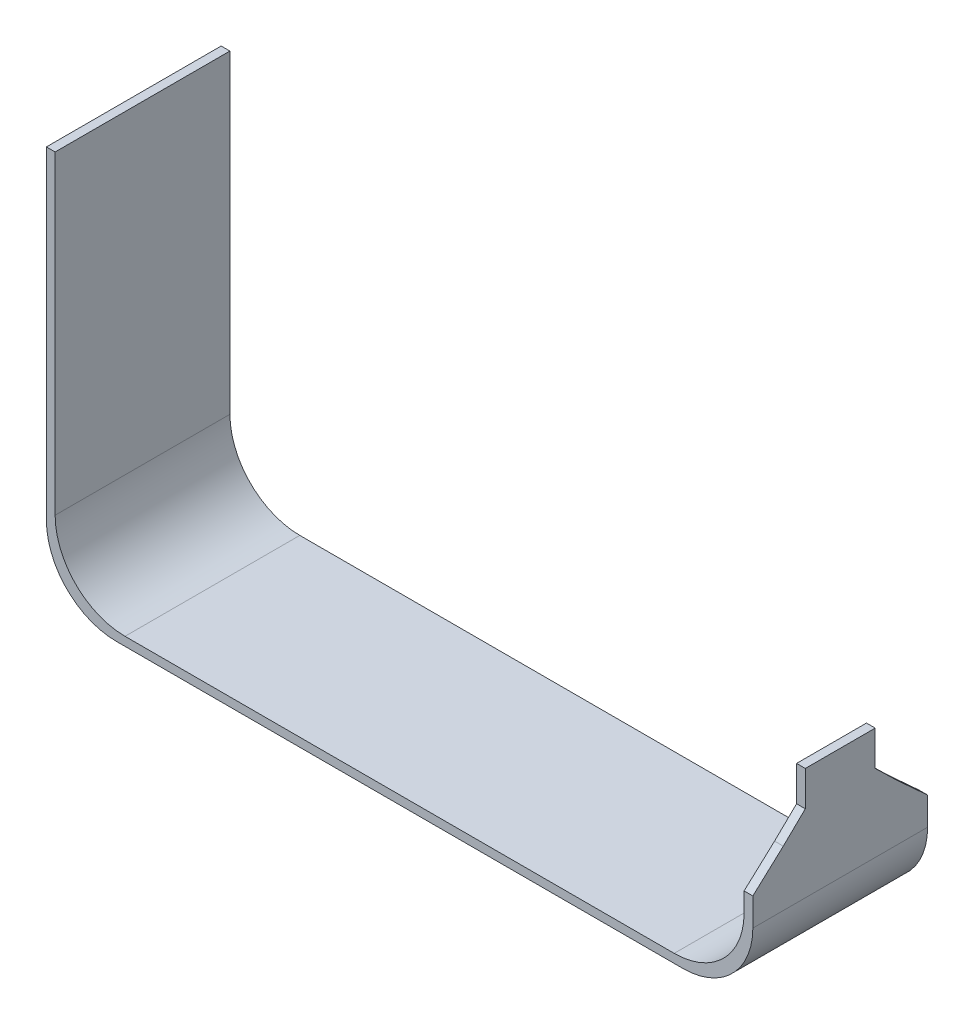
ISO-10303-21;
HEADER;
FILE_DESCRIPTION(('STEP AP214'),'2;1');
FILE_NAME('part.step','',(''),(''),'','','');
FILE_SCHEMA(('AUTOMOTIVE_DESIGN { 1 0 10303 214 1 1 1 1 }'));
ENDSEC;
DATA;
#1=APPLICATION_CONTEXT('core data for automotive mechanical design processes');
#2=APPLICATION_PROTOCOL_DEFINITION('international standard','automotive_design',2000,#1);
#3=PRODUCT_CONTEXT('',#1,'mechanical');
#4=PRODUCT('Part','Part','',(#3));
#5=PRODUCT_RELATED_PRODUCT_CATEGORY('part','',(#4));
#6=PRODUCT_DEFINITION_FORMATION('','',#4);
#7=PRODUCT_DEFINITION_CONTEXT('part definition',#1,'design');
#8=PRODUCT_DEFINITION('design','',#6,#7);
#9=PRODUCT_DEFINITION_SHAPE('','',#8);
#10=(LENGTH_UNIT() NAMED_UNIT(*) SI_UNIT(.MILLI.,.METRE.));
#11=(NAMED_UNIT(*) PLANE_ANGLE_UNIT() SI_UNIT($,.RADIAN.));
#12=(NAMED_UNIT(*) SI_UNIT($,.STERADIAN.) SOLID_ANGLE_UNIT());
#13=UNCERTAINTY_MEASURE_WITH_UNIT(LENGTH_MEASURE(1.E-05),#10,'distance_accuracy_value','');
#14=(GEOMETRIC_REPRESENTATION_CONTEXT(3) GLOBAL_UNCERTAINTY_ASSIGNED_CONTEXT((#13)) GLOBAL_UNIT_ASSIGNED_CONTEXT((#10,
#11,#12)) REPRESENTATION_CONTEXT('',''));
#15=CARTESIAN_POINT('',(0.,0.,0.));
#16=DIRECTION('',(0.,0.,1.));
#17=DIRECTION('',(1.,0.,0.));
#18=AXIS2_PLACEMENT_3D('',#15,#16,#17);
#19=CARTESIAN_POINT('',(-14.7872093023256,2.25,0.));
#20=DIRECTION('',(0.,0.,-1.));
#21=DIRECTION('',(-1.,0.,0.));
#22=AXIS2_PLACEMENT_3D('',#19,#20,#21);
#23=CYLINDRICAL_SURFACE('',#22,2.);
#24=CARTESIAN_POINT('',(-14.7872093023256,2.25,-5.93488372093023));
#25=DIRECTION('',(0.,0.,1.));
#26=DIRECTION('',(1.,0.,0.));
#27=AXIS2_PLACEMENT_3D('',#24,#25,#26);
#28=CIRCLE('',#27,2.);
#29=CARTESIAN_POINT('',(-16.7872093023256,2.25,-5.93488372093023));
#30=VERTEX_POINT('',#29);
#31=CARTESIAN_POINT('',(-14.7872093023256,0.25,-5.93488372093023));
#32=VERTEX_POINT('',#31);
#33=EDGE_CURVE('E261',#30,#32,#28,.T.);
#34=ORIENTED_EDGE('',*,*,#33,.F.);
#35=DIRECTION('',(0.,0.,1.));
#36=VECTOR('',#35,1.);
#37=CARTESIAN_POINT('',(-16.7872093023256,2.25,-5.93488372093023));
#38=LINE('',#37,#36);
#39=CARTESIAN_POINT('',(-16.7872093023256,2.25,-0.934883720930232));
#40=VERTEX_POINT('',#39);
#41=EDGE_CURVE('E257',#40,#30,#38,.F.);
#42=ORIENTED_EDGE('',*,*,#41,.F.);
#43=CARTESIAN_POINT('',(-14.7872093023256,2.25,-0.934883720930232));
#44=DIRECTION('',(0.,0.,-1.));
#45=DIRECTION('',(-1.,0.,0.));
#46=AXIS2_PLACEMENT_3D('',#43,#44,#45);
#47=CIRCLE('',#46,2.);
#48=CARTESIAN_POINT('',(-14.7872093023256,0.25,-0.934883720930232));
#49=VERTEX_POINT('',#48);
#50=EDGE_CURVE('E259',#49,#40,#47,.T.);
#51=ORIENTED_EDGE('',*,*,#50,.F.);
#52=DIRECTION('',(0.,0.,1.));
#53=VECTOR('',#52,1.);
#54=CARTESIAN_POINT('',(-14.7872093023256,0.25,-0.934883720930232));
#55=LINE('',#54,#53);
#56=EDGE_CURVE('E254',#32,#49,#55,.T.);
#57=ORIENTED_EDGE('',*,*,#56,.F.);
#58=EDGE_LOOP('',(#34,#42,#51,#57));
#59=FACE_BOUND('',#58,.T.);
#60=ADVANCED_FACE('F37',(#59),#23,.F.);
#61=CARTESIAN_POINT('',(-16.7872093023256,0.,0.));
#62=DIRECTION('',(1.,0.,0.));
#63=DIRECTION('',(0.,0.,-1.));
#64=AXIS2_PLACEMENT_3D('',#61,#62,#63);
#65=PLANE('',#64);
#66=DIRECTION('',(0.,1.,0.));
#67=VECTOR('',#66,1.);
#68=CARTESIAN_POINT('',(-16.7872093023256,0.25,-0.934883720930232));
#69=LINE('',#68,#67);
#70=CARTESIAN_POINT('',(-16.7872093023256,11.25,-0.934883720930232));
#71=VERTEX_POINT('',#70);
#72=EDGE_CURVE('E226',#40,#71,#69,.T.);
#73=ORIENTED_EDGE('',*,*,#72,.F.);
#74=ORIENTED_EDGE('',*,*,#41,.T.);
#75=DIRECTION('',(0.,-1.,0.));
#76=VECTOR('',#75,1.);
#77=CARTESIAN_POINT('',(-16.7872093023256,0.25,-5.93488372093023));
#78=LINE('',#77,#76);
#79=CARTESIAN_POINT('',(-16.7872093023256,11.25,-5.93488372093023));
#80=VERTEX_POINT('',#79);
#81=EDGE_CURVE('E223',#80,#30,#78,.T.);
#82=ORIENTED_EDGE('',*,*,#81,.F.);
#83=DIRECTION('',(0.,0.,-1.));
#84=VECTOR('',#83,1.);
#85=CARTESIAN_POINT('',(-16.7872093023256,11.25,-5.93488372093023));
#86=LINE('',#85,#84);
#87=EDGE_CURVE('E228',#71,#80,#86,.T.);
#88=ORIENTED_EDGE('',*,*,#87,.F.);
#89=EDGE_LOOP('',(#73,#74,#82,#88));
#90=FACE_BOUND('',#89,.T.);
#91=ADVANCED_FACE('F313',(#90),#65,.T.);
#92=CARTESIAN_POINT('',(-16.7872093023256,11.25,-5.93488372093023));
#93=DIRECTION('',(0.,1.,0.));
#94=DIRECTION('',(0.,0.,1.));
#95=AXIS2_PLACEMENT_3D('',#92,#93,#94);
#96=PLANE('',#95);
#97=DIRECTION('',(0.,0.,-1.));
#98=VECTOR('',#97,1.);
#99=CARTESIAN_POINT('',(-17.0372093023256,11.25,-5.93488372093023));
#100=LINE('',#99,#98);
#101=CARTESIAN_POINT('',(-17.0372093023256,11.25,-0.934883720930232));
#102=VERTEX_POINT('',#101);
#103=CARTESIAN_POINT('',(-17.0372093023256,11.25,-5.93488372093023));
#104=VERTEX_POINT('',#103);
#105=EDGE_CURVE('E219',#102,#104,#100,.T.);
#106=ORIENTED_EDGE('',*,*,#105,.F.);
#107=DIRECTION('',(-1.,0.,0.));
#108=VECTOR('',#107,1.);
#109=CARTESIAN_POINT('',(-16.7872093023256,11.25,-0.934883720930232));
#110=LINE('',#109,#108);
#111=EDGE_CURVE('E231',#71,#102,#110,.T.);
#112=ORIENTED_EDGE('',*,*,#111,.F.);
#113=ORIENTED_EDGE('',*,*,#87,.T.);
#114=DIRECTION('',(-1.,0.,0.));
#115=VECTOR('',#114,1.);
#116=CARTESIAN_POINT('',(-16.7872093023256,11.25,-5.93488372093023));
#117=LINE('',#116,#115);
#118=EDGE_CURVE('E234',#80,#104,#117,.T.);
#119=ORIENTED_EDGE('',*,*,#118,.T.);
#120=EDGE_LOOP('',(#106,#112,#113,#119));
#121=FACE_BOUND('',#120,.T.);
#122=ADVANCED_FACE('F307',(#121),#96,.T.);
#123=CARTESIAN_POINT('',(-17.0372093023256,0.25,-5.93488372093023));
#124=DIRECTION('',(1.,0.,0.));
#125=DIRECTION('',(0.,0.,-1.));
#126=AXIS2_PLACEMENT_3D('',#123,#124,#125);
#127=PLANE('',#126);
#128=DIRECTION('',(0.,-1.,0.));
#129=VECTOR('',#128,1.);
#130=CARTESIAN_POINT('',(-17.0372093023256,0.25,-5.93488372093023));
#131=LINE('',#130,#129);
#132=CARTESIAN_POINT('',(-17.0372093023256,2.,-5.93488372093023));
#133=VERTEX_POINT('',#132);
#134=EDGE_CURVE('E246',#104,#133,#131,.T.);
#135=ORIENTED_EDGE('',*,*,#134,.T.);
#136=DIRECTION('',(0.,0.,1.));
#137=VECTOR('',#136,1.);
#138=CARTESIAN_POINT('',(-17.0372093023256,2.,-5.93488372093023));
#139=LINE('',#138,#137);
#140=CARTESIAN_POINT('',(-17.0372093023256,2.,-0.934883720930232));
#141=VERTEX_POINT('',#140);
#142=EDGE_CURVE('E271',#133,#141,#139,.T.);
#143=ORIENTED_EDGE('',*,*,#142,.T.);
#144=DIRECTION('',(0.,-1.,0.));
#145=VECTOR('',#144,1.);
#146=CARTESIAN_POINT('',(-17.0372093023256,0.25,-0.934883720930232));
#147=LINE('',#146,#145);
#148=EDGE_CURVE('E251',#102,#141,#147,.T.);
#149=ORIENTED_EDGE('',*,*,#148,.F.);
#150=ORIENTED_EDGE('',*,*,#105,.T.);
#151=EDGE_LOOP('',(#135,#143,#149,#150));
#152=FACE_BOUND('',#151,.T.);
#153=ADVANCED_FACE('F303',(#152),#127,.F.);
#154=CARTESIAN_POINT('',(-15.0372093023256,2.,-5.93488372093023));
#155=DIRECTION('',(0.,0.,1.));
#156=DIRECTION('',(1.,0.,0.));
#157=AXIS2_PLACEMENT_3D('',#154,#155,#156);
#158=CYLINDRICAL_SURFACE('',#157,2.);
#159=CARTESIAN_POINT('',(-15.0372093023256,2.,-5.93488372093023));
#160=DIRECTION('',(0.,0.,1.));
#161=DIRECTION('',(1.,0.,0.));
#162=AXIS2_PLACEMENT_3D('',#159,#160,#161);
#163=CIRCLE('',#162,2.);
#164=CARTESIAN_POINT('',(-15.0372093023256,0.,-5.93488372093023));
#165=VERTEX_POINT('',#164);
#166=EDGE_CURVE('E264',#165,#133,#163,.F.);
#167=ORIENTED_EDGE('',*,*,#166,.F.);
#168=DIRECTION('',(0.,0.,1.));
#169=VECTOR('',#168,1.);
#170=CARTESIAN_POINT('',(-15.0372093023256,0.,0.));
#171=LINE('',#170,#169);
#172=CARTESIAN_POINT('',(-15.0372093023256,0.,-0.934883720930232));
#173=VERTEX_POINT('',#172);
#174=EDGE_CURVE('E266',#173,#165,#171,.F.);
#175=ORIENTED_EDGE('',*,*,#174,.F.);
#176=CARTESIAN_POINT('',(-15.0372093023256,2.,-0.934883720930232));
#177=DIRECTION('',(0.,0.,-1.));
#178=DIRECTION('',(-1.,0.,0.));
#179=AXIS2_PLACEMENT_3D('',#176,#177,#178);
#180=CIRCLE('',#179,2.);
#181=EDGE_CURVE('E269',#141,#173,#180,.F.);
#182=ORIENTED_EDGE('',*,*,#181,.F.);
#183=ORIENTED_EDGE('',*,*,#142,.F.);
#184=EDGE_LOOP('',(#167,#175,#182,#183));
#185=FACE_BOUND('',#184,.T.);
#186=ADVANCED_FACE('F300',(#185),#158,.T.);
#187=CARTESIAN_POINT('',(0.,0.,0.));
#188=DIRECTION('',(0.,1.,0.));
#189=DIRECTION('',(0.,0.,1.));
#190=AXIS2_PLACEMENT_3D('',#187,#188,#189);
#191=PLANE('',#190);
#192=DIRECTION('',(-1.,0.,0.));
#193=VECTOR('',#192,1.);
#194=CARTESIAN_POINT('',(-17.0372093023256,0.,-5.93488372093023));
#195=LINE('',#194,#193);
#196=CARTESIAN_POINT('',(1.17333889146334,0.,-5.93488372093023));
#197=VERTEX_POINT('',#196);
#198=EDGE_CURVE('E244',#197,#165,#195,.T.);
#199=ORIENTED_EDGE('',*,*,#198,.F.);
#200=DIRECTION('',(0.,0.,-1.));
#201=VECTOR('',#200,1.);
#202=CARTESIAN_POINT('',(1.17333889146334,0.,0.));
#203=LINE('',#202,#201);
#204=CARTESIAN_POINT('',(1.17333889146334,0.,-0.934883720930232));
#205=VERTEX_POINT('',#204);
#206=EDGE_CURVE('E45',#197,#205,#203,.F.);
#207=ORIENTED_EDGE('',*,*,#206,.T.);
#208=DIRECTION('',(1.,0.,0.));
#209=VECTOR('',#208,1.);
#210=CARTESIAN_POINT('',(-17.0372093023256,0.,-0.934883720930232));
#211=LINE('',#210,#209);
#212=EDGE_CURVE('E237',#173,#205,#211,.T.);
#213=ORIENTED_EDGE('',*,*,#212,.F.);
#214=ORIENTED_EDGE('',*,*,#174,.T.);
#215=EDGE_LOOP('',(#199,#207,#213,#214));
#216=FACE_BOUND('',#215,.T.);
#217=ADVANCED_FACE('F292',(#216),#191,.F.);
#218=CARTESIAN_POINT('',(-17.0372093023256,0.25,-5.93488372093023));
#219=DIRECTION('',(0.,0.,1.));
#220=DIRECTION('',(1.,0.,0.));
#221=AXIS2_PLACEMENT_3D('',#218,#219,#220);
#222=PLANE('',#221);
#223=DIRECTION('',(0.,1.,0.));
#224=VECTOR('',#223,1.);
#225=CARTESIAN_POINT('',(2.92333889146334,0.,-5.93488372093023));
#226=LINE('',#225,#224);
#227=CARTESIAN_POINT('',(2.92333889146334,2.25,-5.93488372093023));
#228=VERTEX_POINT('',#227);
#229=CARTESIAN_POINT('',(2.92333889146334,2.79767860252511,-5.93488372093023));
#230=VERTEX_POINT('',#229);
#231=EDGE_CURVE('E216',#228,#230,#226,.T.);
#232=ORIENTED_EDGE('',*,*,#231,.T.);
#233=DIRECTION('',(1.,0.,0.));
#234=VECTOR('',#233,1.);
#235=CARTESIAN_POINT('',(2.92333889146334,2.79767860252511,-5.93488372093023));
#236=LINE('',#235,#234);
#237=CARTESIAN_POINT('',(3.17333889146334,2.79767860252511,-5.93488372093023));
#238=VERTEX_POINT('',#237);
#239=EDGE_CURVE('E329',#230,#238,#236,.T.);
#240=ORIENTED_EDGE('',*,*,#239,.T.);
#241=DIRECTION('',(0.,1.,0.));
#242=VECTOR('',#241,1.);
#243=CARTESIAN_POINT('',(3.17333889146334,0.,-5.93488372093023));
#244=LINE('',#243,#242);
#245=CARTESIAN_POINT('',(3.17333889146334,2.,-5.93488372093023));
#246=VERTEX_POINT('',#245);
#247=EDGE_CURVE('E215',#246,#238,#244,.T.);
#248=ORIENTED_EDGE('',*,*,#247,.F.);
#249=CARTESIAN_POINT('',(1.17333889146334,2.,-5.93488372093023));
#250=DIRECTION('',(0.,0.,1.));
#251=DIRECTION('',(1.,0.,0.));
#252=AXIS2_PLACEMENT_3D('',#249,#250,#251);
#253=CIRCLE('',#252,2.);
#254=EDGE_CURVE('E285',#246,#197,#253,.F.);
#255=ORIENTED_EDGE('',*,*,#254,.T.);
#256=ORIENTED_EDGE('',*,*,#198,.T.);
#257=ORIENTED_EDGE('',*,*,#166,.T.);
#258=ORIENTED_EDGE('',*,*,#134,.F.);
#259=ORIENTED_EDGE('',*,*,#118,.F.);
#260=ORIENTED_EDGE('',*,*,#81,.T.);
#261=ORIENTED_EDGE('',*,*,#33,.T.);
#262=DIRECTION('',(-1.,0.,0.));
#263=VECTOR('',#262,1.);
#264=CARTESIAN_POINT('',(-17.0372093023256,0.25,-5.93488372093023));
#265=LINE('',#264,#263);
#266=CARTESIAN_POINT('',(0.923338891463343,0.25,-5.93488372093023));
#267=VERTEX_POINT('',#266);
#268=EDGE_CURVE('E243',#267,#32,#265,.T.);
#269=ORIENTED_EDGE('',*,*,#268,.F.);
#270=CARTESIAN_POINT('',(0.923338891463343,2.25,-5.93488372093023));
#271=DIRECTION('',(0.,0.,1.));
#272=DIRECTION('',(1.,0.,0.));
#273=AXIS2_PLACEMENT_3D('',#270,#271,#272);
#274=CIRCLE('',#273,2.);
#275=EDGE_CURVE('E280',#267,#228,#274,.T.);
#276=ORIENTED_EDGE('',*,*,#275,.T.);
#277=EDGE_LOOP('',(#232,#240,#248,#255,#256,#257,#258,#259,#260,#261,#269,#276));
#278=FACE_BOUND('',#277,.T.);
#279=ADVANCED_FACE('F288',(#278),#222,.F.);
#280=CARTESIAN_POINT('',(-17.0372093023256,0.25,-0.934883720930232));
#281=DIRECTION('',(0.,0.,-1.));
#282=DIRECTION('',(-1.,0.,0.));
#283=AXIS2_PLACEMENT_3D('',#280,#281,#282);
#284=PLANE('',#283);
#285=DIRECTION('',(0.,-1.,0.));
#286=VECTOR('',#285,1.);
#287=CARTESIAN_POINT('',(3.17333889146334,0.,-0.934883720930232));
#288=LINE('',#287,#286);
#289=CARTESIAN_POINT('',(3.17333889146334,2.79767860252511,-0.934883720930232));
#290=VERTEX_POINT('',#289);
#291=CARTESIAN_POINT('',(3.17333889146334,2.,-0.934883720930232));
#292=VERTEX_POINT('',#291);
#293=EDGE_CURVE('E213',#290,#292,#288,.T.);
#294=ORIENTED_EDGE('',*,*,#293,.F.);
#295=DIRECTION('',(1.,0.,0.));
#296=VECTOR('',#295,1.);
#297=CARTESIAN_POINT('',(2.92333889146334,2.79767860252511,-0.934883720930232));
#298=LINE('',#297,#296);
#299=CARTESIAN_POINT('',(2.92333889146334,2.79767860252511,-0.934883720930232));
#300=VERTEX_POINT('',#299);
#301=EDGE_CURVE('E179',#300,#290,#298,.T.);
#302=ORIENTED_EDGE('',*,*,#301,.F.);
#303=DIRECTION('',(0.,-1.,0.));
#304=VECTOR('',#303,1.);
#305=CARTESIAN_POINT('',(2.92333889146334,0.,-0.934883720930232));
#306=LINE('',#305,#304);
#307=CARTESIAN_POINT('',(2.92333889146334,2.25,-0.934883720930232));
#308=VERTEX_POINT('',#307);
#309=EDGE_CURVE('E169',#300,#308,#306,.T.);
#310=ORIENTED_EDGE('',*,*,#309,.T.);
#311=CARTESIAN_POINT('',(0.923338891463343,2.25,-0.934883720930232));
#312=DIRECTION('',(0.,0.,-1.));
#313=DIRECTION('',(-1.,0.,0.));
#314=AXIS2_PLACEMENT_3D('',#311,#312,#313);
#315=CIRCLE('',#314,2.);
#316=CARTESIAN_POINT('',(0.923338891463343,0.25,-0.934883720930232));
#317=VERTEX_POINT('',#316);
#318=EDGE_CURVE('E278',#308,#317,#315,.T.);
#319=ORIENTED_EDGE('',*,*,#318,.T.);
#320=DIRECTION('',(1.,0.,0.));
#321=VECTOR('',#320,1.);
#322=CARTESIAN_POINT('',(-17.0372093023256,0.25,-0.934883720930232));
#323=LINE('',#322,#321);
#324=EDGE_CURVE('E240',#49,#317,#323,.T.);
#325=ORIENTED_EDGE('',*,*,#324,.F.);
#326=ORIENTED_EDGE('',*,*,#50,.T.);
#327=ORIENTED_EDGE('',*,*,#72,.T.);
#328=ORIENTED_EDGE('',*,*,#111,.T.);
#329=ORIENTED_EDGE('',*,*,#148,.T.);
#330=ORIENTED_EDGE('',*,*,#181,.T.);
#331=ORIENTED_EDGE('',*,*,#212,.T.);
#332=CARTESIAN_POINT('',(1.17333889146334,2.,-0.934883720930232));
#333=DIRECTION('',(0.,0.,-1.));
#334=DIRECTION('',(-1.,0.,0.));
#335=AXIS2_PLACEMENT_3D('',#332,#333,#334);
#336=CIRCLE('',#335,2.);
#337=EDGE_CURVE('E11',#205,#292,#336,.F.);
#338=ORIENTED_EDGE('',*,*,#337,.T.);
#339=EDGE_LOOP('',(#294,#302,#310,#319,#325,#326,#327,#328,#329,#330,#331,#338));
#340=FACE_BOUND('',#339,.T.);
#341=ADVANCED_FACE('F298',(#340),#284,.F.);
#342=CARTESIAN_POINT('',(0.,0.25,0.));
#343=DIRECTION('',(0.,1.,0.));
#344=DIRECTION('',(0.,0.,1.));
#345=AXIS2_PLACEMENT_3D('',#342,#343,#344);
#346=PLANE('',#345);
#347=ORIENTED_EDGE('',*,*,#324,.T.);
#348=DIRECTION('',(0.,0.,1.));
#349=VECTOR('',#348,1.);
#350=CARTESIAN_POINT('',(0.923338891463343,0.25,-5.93488372093023));
#351=LINE('',#350,#349);
#352=EDGE_CURVE('E276',#317,#267,#351,.F.);
#353=ORIENTED_EDGE('',*,*,#352,.T.);
#354=ORIENTED_EDGE('',*,*,#268,.T.);
#355=ORIENTED_EDGE('',*,*,#56,.T.);
#356=EDGE_LOOP('',(#347,#353,#354,#355));
#357=FACE_BOUND('',#356,.T.);
#358=ADVANCED_FACE('F388',(#357),#346,.T.);
#359=CARTESIAN_POINT('',(3.17333889146334,0.,0.));
#360=DIRECTION('',(-1.,0.,0.));
#361=DIRECTION('',(0.,0.,1.));
#362=AXIS2_PLACEMENT_3D('',#359,#360,#361);
#363=PLANE('',#362);
#364=DIRECTION('',(0.,-0.69631816508284,0.71773324639149));
#365=VECTOR('',#364,1.);
#366=CARTESIAN_POINT('',(3.17333889146334,2.75,-0.934883720930232));
#367=LINE('',#366,#365);
#368=CARTESIAN_POINT('',(3.17333889146334,4.20590966466017,-2.43556950290315));
#369=VERTEX_POINT('',#368);
#370=CARTESIAN_POINT('',(3.17333889146334,3.59535720505022,-1.80623966361047));
#371=VERTEX_POINT('',#370);
#372=EDGE_CURVE('E205',#369,#371,#367,.T.);
#373=ORIENTED_EDGE('',*,*,#372,.T.);
#374=DIRECTION('',(0.,0.675234896912932,-0.737602761648153));
#375=VECTOR('',#374,1.);
#376=CARTESIAN_POINT('',(3.17333889146334,2.79767860252511,-0.934883720930232));
#377=LINE('',#376,#375);
#378=EDGE_CURVE('E52',#290,#371,#377,.T.);
#379=ORIENTED_EDGE('',*,*,#378,.F.);
#380=ORIENTED_EDGE('',*,*,#293,.T.);
#381=DIRECTION('',(0.,0.,-1.));
#382=VECTOR('',#381,1.);
#383=CARTESIAN_POINT('',(3.17333889146334,2.,0.));
#384=LINE('',#383,#382);
#385=EDGE_CURVE('E282',#292,#246,#384,.T.);
#386=ORIENTED_EDGE('',*,*,#385,.T.);
#387=ORIENTED_EDGE('',*,*,#247,.T.);
#388=DIRECTION('',(0.,-0.675570751788445,-0.737295164318874));
#389=VECTOR('',#388,1.);
#390=CARTESIAN_POINT('',(3.17333889146334,2.79767860252511,-5.93488372093023));
#391=LINE('',#390,#389);
#392=CARTESIAN_POINT('',(3.17333889146334,3.59535720505022,-5.06432416108331));
#393=VERTEX_POINT('',#392);
#394=EDGE_CURVE('E335',#393,#238,#391,.T.);
#395=ORIENTED_EDGE('',*,*,#394,.F.);
#396=DIRECTION('',(0.,0.696646085409808,0.717414964775053));
#397=VECTOR('',#396,1.);
#398=CARTESIAN_POINT('',(3.17333889146334,2.75,-5.93488372093023));
#399=LINE('',#398,#397);
#400=CARTESIAN_POINT('',(3.17333889146334,4.20590966466017,-4.43556950290315));
#401=VERTEX_POINT('',#400);
#402=EDGE_CURVE('E194',#393,#401,#399,.T.);
#403=ORIENTED_EDGE('',*,*,#402,.T.);
#404=DIRECTION('',(0.,1.,0.));
#405=VECTOR('',#404,1.);
#406=CARTESIAN_POINT('',(3.17333889146334,5.20590966466017,-4.43556950290315));
#407=LINE('',#406,#405);
#408=CARTESIAN_POINT('',(3.17333889146334,5.20590966466017,-4.43556950290315));
#409=VERTEX_POINT('',#408);
#410=EDGE_CURVE('E196',#401,#409,#407,.T.);
#411=ORIENTED_EDGE('',*,*,#410,.T.);
#412=DIRECTION('',(0.,0.,1.));
#413=VECTOR('',#412,1.);
#414=CARTESIAN_POINT('',(3.17333889146334,5.20590966466017,-2.43556950290315));
#415=LINE('',#414,#413);
#416=CARTESIAN_POINT('',(3.17333889146334,5.20590966466017,-2.43556950290315));
#417=VERTEX_POINT('',#416);
#418=EDGE_CURVE('E199',#409,#417,#415,.T.);
#419=ORIENTED_EDGE('',*,*,#418,.T.);
#420=DIRECTION('',(0.,-1.,0.));
#421=VECTOR('',#420,1.);
#422=CARTESIAN_POINT('',(3.17333889146334,4.20590966466017,-2.43556950290315));
#423=LINE('',#422,#421);
#424=EDGE_CURVE('E202',#417,#369,#423,.T.);
#425=ORIENTED_EDGE('',*,*,#424,.T.);
#426=EDGE_LOOP('',(#373,#379,#380,#386,#387,#395,#403,#411,#419,#425));
#427=FACE_BOUND('',#426,.T.);
#428=ADVANCED_FACE('F334',(#427),#363,.F.);
#429=CARTESIAN_POINT('',(2.92333889146334,0.,0.));
#430=DIRECTION('',(-1.,0.,0.));
#431=DIRECTION('',(0.,0.,1.));
#432=AXIS2_PLACEMENT_3D('',#429,#430,#431);
#433=PLANE('',#432);
#434=DIRECTION('',(0.,0.675234896912932,-0.737602761648153));
#435=VECTOR('',#434,1.);
#436=CARTESIAN_POINT('',(2.92333889146334,2.79767860252511,-0.934883720930232));
#437=LINE('',#436,#435);
#438=CARTESIAN_POINT('',(2.92333889146334,3.59535720505022,-1.80623966361047));
#439=VERTEX_POINT('',#438);
#440=EDGE_CURVE('E164',#300,#439,#437,.T.);
#441=ORIENTED_EDGE('',*,*,#440,.T.);
#442=DIRECTION('',(0.,-0.69631816508284,0.71773324639149));
#443=VECTOR('',#442,1.);
#444=CARTESIAN_POINT('',(2.92333889146334,2.75,-0.934883720930232));
#445=LINE('',#444,#443);
#446=CARTESIAN_POINT('',(2.92333889146334,4.20590966466017,-2.43556950290315));
#447=VERTEX_POINT('',#446);
#448=EDGE_CURVE('E177',#447,#439,#445,.T.);
#449=ORIENTED_EDGE('',*,*,#448,.F.);
#450=DIRECTION('',(0.,-1.,0.));
#451=VECTOR('',#450,1.);
#452=CARTESIAN_POINT('',(2.92333889146334,4.20590966466017,-2.43556950290315));
#453=LINE('',#452,#451);
#454=CARTESIAN_POINT('',(2.92333889146334,5.20590966466017,-2.43556950290315));
#455=VERTEX_POINT('',#454);
#456=EDGE_CURVE('E185',#455,#447,#453,.T.);
#457=ORIENTED_EDGE('',*,*,#456,.F.);
#458=DIRECTION('',(0.,0.,1.));
#459=VECTOR('',#458,1.);
#460=CARTESIAN_POINT('',(2.92333889146334,5.20590966466017,-2.43556950290315));
#461=LINE('',#460,#459);
#462=CARTESIAN_POINT('',(2.92333889146334,5.20590966466017,-4.43556950290315));
#463=VERTEX_POINT('',#462);
#464=EDGE_CURVE('E190',#463,#455,#461,.T.);
#465=ORIENTED_EDGE('',*,*,#464,.F.);
#466=DIRECTION('',(0.,1.,0.));
#467=VECTOR('',#466,1.);
#468=CARTESIAN_POINT('',(2.92333889146334,5.20590966466017,-4.43556950290315));
#469=LINE('',#468,#467);
#470=CARTESIAN_POINT('',(2.92333889146334,4.20590966466017,-4.43556950290315));
#471=VERTEX_POINT('',#470);
#472=EDGE_CURVE('E343',#471,#463,#469,.T.);
#473=ORIENTED_EDGE('',*,*,#472,.F.);
#474=DIRECTION('',(0.,0.696646085409808,0.717414964775053));
#475=VECTOR('',#474,1.);
#476=CARTESIAN_POINT('',(2.92333889146334,2.75,-5.93488372093023));
#477=LINE('',#476,#475);
#478=CARTESIAN_POINT('',(2.92333889146334,3.59535720505022,-5.06432416108331));
#479=VERTEX_POINT('',#478);
#480=EDGE_CURVE('E207',#479,#471,#477,.T.);
#481=ORIENTED_EDGE('',*,*,#480,.F.);
#482=DIRECTION('',(0.,-0.675570751788445,-0.737295164318874));
#483=VECTOR('',#482,1.);
#484=CARTESIAN_POINT('',(2.92333889146334,2.79767860252511,-5.93488372093023));
#485=LINE('',#484,#483);
#486=EDGE_CURVE('E328',#479,#230,#485,.T.);
#487=ORIENTED_EDGE('',*,*,#486,.T.);
#488=ORIENTED_EDGE('',*,*,#231,.F.);
#489=DIRECTION('',(0.,0.,1.));
#490=VECTOR('',#489,1.);
#491=CARTESIAN_POINT('',(2.92333889146334,2.25,-0.934883720930232));
#492=LINE('',#491,#490);
#493=EDGE_CURVE('E274',#228,#308,#492,.T.);
#494=ORIENTED_EDGE('',*,*,#493,.T.);
#495=ORIENTED_EDGE('',*,*,#309,.F.);
#496=EDGE_LOOP('',(#441,#449,#457,#465,#473,#481,#487,#488,#494,#495));
#497=FACE_BOUND('',#496,.T.);
#498=ADVANCED_FACE('F175',(#497),#433,.T.);
#499=CARTESIAN_POINT('',(0.923338891463343,2.25,0.));
#500=DIRECTION('',(0.,0.,-1.));
#501=DIRECTION('',(-1.,0.,0.));
#502=AXIS2_PLACEMENT_3D('',#499,#500,#501);
#503=CYLINDRICAL_SURFACE('',#502,2.);
#504=ORIENTED_EDGE('',*,*,#275,.F.);
#505=ORIENTED_EDGE('',*,*,#352,.F.);
#506=ORIENTED_EDGE('',*,*,#318,.F.);
#507=ORIENTED_EDGE('',*,*,#493,.F.);
#508=EDGE_LOOP('',(#504,#505,#506,#507));
#509=FACE_BOUND('',#508,.T.);
#510=ADVANCED_FACE('F324',(#509),#503,.F.);
#511=CARTESIAN_POINT('',(1.17333889146334,2.,0.));
#512=DIRECTION('',(0.,0.,-1.));
#513=DIRECTION('',(-1.,0.,0.));
#514=AXIS2_PLACEMENT_3D('',#511,#512,#513);
#515=CYLINDRICAL_SURFACE('',#514,2.);
#516=ORIENTED_EDGE('',*,*,#337,.F.);
#517=ORIENTED_EDGE('',*,*,#206,.F.);
#518=ORIENTED_EDGE('',*,*,#254,.F.);
#519=ORIENTED_EDGE('',*,*,#385,.F.);
#520=EDGE_LOOP('',(#516,#517,#518,#519));
#521=FACE_BOUND('',#520,.T.);
#522=ADVANCED_FACE('F39',(#521),#515,.T.);
#523=CARTESIAN_POINT('',(2.92333889146334,2.75,-0.934883720930232));
#524=DIRECTION('',(0.,0.71773324639149,0.69631816508284));
#525=DIRECTION('',(0.,-0.69631816508284,0.71773324639149));
#526=AXIS2_PLACEMENT_3D('',#523,#524,#525);
#527=PLANE('',#526);
#528=DIRECTION('',(-1.,0.,0.));
#529=VECTOR('',#528,1.);
#530=CARTESIAN_POINT('',(3.17333889146334,3.59535720505022,-1.80623966361047));
#531=LINE('',#530,#529);
#532=EDGE_CURVE('E161',#371,#439,#531,.T.);
#533=ORIENTED_EDGE('',*,*,#532,.F.);
#534=ORIENTED_EDGE('',*,*,#372,.F.);
#535=DIRECTION('',(1.,0.,0.));
#536=VECTOR('',#535,1.);
#537=CARTESIAN_POINT('',(2.92333889146334,4.20590966466017,-2.43556950290315));
#538=LINE('',#537,#536);
#539=EDGE_CURVE('E182',#447,#369,#538,.T.);
#540=ORIENTED_EDGE('',*,*,#539,.F.);
#541=ORIENTED_EDGE('',*,*,#448,.T.);
#542=EDGE_LOOP('',(#533,#534,#540,#541));
#543=FACE_BOUND('',#542,.T.);
#544=ADVANCED_FACE('F181',(#543),#527,.T.);
#545=CARTESIAN_POINT('',(2.92333889146334,2.75,-5.93488372093023));
#546=DIRECTION('',(0.,0.717414964775053,-0.696646085409808));
#547=DIRECTION('',(0.,0.696646085409808,0.717414964775053));
#548=AXIS2_PLACEMENT_3D('',#545,#546,#547);
#549=PLANE('',#548);
#550=DIRECTION('',(1.,0.,0.));
#551=VECTOR('',#550,1.);
#552=CARTESIAN_POINT('',(3.17333889146334,3.59535720505022,-5.06432416108331));
#553=LINE('',#552,#551);
#554=EDGE_CURVE('E170',#479,#393,#553,.T.);
#555=ORIENTED_EDGE('',*,*,#554,.F.);
#556=ORIENTED_EDGE('',*,*,#480,.T.);
#557=DIRECTION('',(1.,0.,0.));
#558=VECTOR('',#557,1.);
#559=CARTESIAN_POINT('',(2.92333889146334,4.20590966466017,-4.43556950290315));
#560=LINE('',#559,#558);
#561=EDGE_CURVE('E184',#471,#401,#560,.T.);
#562=ORIENTED_EDGE('',*,*,#561,.T.);
#563=ORIENTED_EDGE('',*,*,#402,.F.);
#564=EDGE_LOOP('',(#555,#556,#562,#563));
#565=FACE_BOUND('',#564,.T.);
#566=ADVANCED_FACE('F358',(#565),#549,.T.);
#567=CARTESIAN_POINT('',(2.92333889146334,4.20590966466017,-2.43556950290315));
#568=DIRECTION('',(0.,0.,1.));
#569=DIRECTION('',(1.,0.,0.));
#570=AXIS2_PLACEMENT_3D('',#567,#568,#569);
#571=PLANE('',#570);
#572=ORIENTED_EDGE('',*,*,#424,.F.);
#573=DIRECTION('',(1.,0.,0.));
#574=VECTOR('',#573,1.);
#575=CARTESIAN_POINT('',(2.92333889146334,5.20590966466017,-2.43556950290315));
#576=LINE('',#575,#574);
#577=EDGE_CURVE('E209',#455,#417,#576,.T.);
#578=ORIENTED_EDGE('',*,*,#577,.F.);
#579=ORIENTED_EDGE('',*,*,#456,.T.);
#580=ORIENTED_EDGE('',*,*,#539,.T.);
#581=EDGE_LOOP('',(#572,#578,#579,#580));
#582=FACE_BOUND('',#581,.T.);
#583=ADVANCED_FACE('F436',(#582),#571,.T.);
#584=CARTESIAN_POINT('',(2.92333889146334,5.20590966466017,-2.43556950290315));
#585=DIRECTION('',(0.,1.,0.));
#586=DIRECTION('',(0.,0.,1.));
#587=AXIS2_PLACEMENT_3D('',#584,#585,#586);
#588=PLANE('',#587);
#589=ORIENTED_EDGE('',*,*,#418,.F.);
#590=DIRECTION('',(1.,0.,0.));
#591=VECTOR('',#590,1.);
#592=CARTESIAN_POINT('',(2.92333889146334,5.20590966466017,-4.43556950290315));
#593=LINE('',#592,#591);
#594=EDGE_CURVE('E188',#463,#409,#593,.T.);
#595=ORIENTED_EDGE('',*,*,#594,.F.);
#596=ORIENTED_EDGE('',*,*,#464,.T.);
#597=ORIENTED_EDGE('',*,*,#577,.T.);
#598=EDGE_LOOP('',(#589,#595,#596,#597));
#599=FACE_BOUND('',#598,.T.);
#600=ADVANCED_FACE('F349',(#599),#588,.T.);
#601=CARTESIAN_POINT('',(2.92333889146334,5.20590966466017,-4.43556950290315));
#602=DIRECTION('',(0.,0.,-1.));
#603=DIRECTION('',(-1.,0.,0.));
#604=AXIS2_PLACEMENT_3D('',#601,#602,#603);
#605=PLANE('',#604);
#606=ORIENTED_EDGE('',*,*,#410,.F.);
#607=ORIENTED_EDGE('',*,*,#561,.F.);
#608=ORIENTED_EDGE('',*,*,#472,.T.);
#609=ORIENTED_EDGE('',*,*,#594,.T.);
#610=EDGE_LOOP('',(#606,#607,#608,#609));
#611=FACE_BOUND('',#610,.T.);
#612=ADVANCED_FACE('F355',(#611),#605,.T.);
#613=CARTESIAN_POINT('',(2.92333889146334,2.79767860252511,-5.93488372093023));
#614=DIRECTION('',(0.,-0.737295164318874,0.675570751788445));
#615=DIRECTION('',(0.,-0.675570751788445,-0.737295164318874));
#616=AXIS2_PLACEMENT_3D('',#613,#614,#615);
#617=PLANE('',#616);
#618=ORIENTED_EDGE('',*,*,#394,.T.);
#619=ORIENTED_EDGE('',*,*,#239,.F.);
#620=ORIENTED_EDGE('',*,*,#486,.F.);
#621=ORIENTED_EDGE('',*,*,#554,.T.);
#622=EDGE_LOOP('',(#618,#619,#620,#621));
#623=FACE_BOUND('',#622,.T.);
#624=ADVANCED_FACE('F359',(#623),#617,.F.);
#625=CARTESIAN_POINT('',(2.92333889146334,2.79767860252511,-0.934883720930232));
#626=DIRECTION('',(0.,-0.737602761648153,-0.675234896912932));
#627=DIRECTION('',(0.,0.675234896912932,-0.737602761648153));
#628=AXIS2_PLACEMENT_3D('',#625,#626,#627);
#629=PLANE('',#628);
#630=ORIENTED_EDGE('',*,*,#378,.T.);
#631=ORIENTED_EDGE('',*,*,#532,.T.);
#632=ORIENTED_EDGE('',*,*,#440,.F.);
#633=ORIENTED_EDGE('',*,*,#301,.T.);
#634=EDGE_LOOP('',(#630,#631,#632,#633));
#635=FACE_BOUND('',#634,.T.);
#636=ADVANCED_FACE('F163',(#635),#629,.F.);
#637=CLOSED_SHELL('',(#60,#91,#122,#153,#186,#217,#279,#341,#358,#428,#498,#510,#522,#544,#566,
#583,#600,#612,#624,#636));
#638=MANIFOLD_SOLID_BREP('B2',#637);
#639=ADVANCED_BREP_SHAPE_REPRESENTATION('',(#18,#638),#14);
#640=SHAPE_DEFINITION_REPRESENTATION(#9,#639);
ENDSEC;
END-ISO-10303-21;
